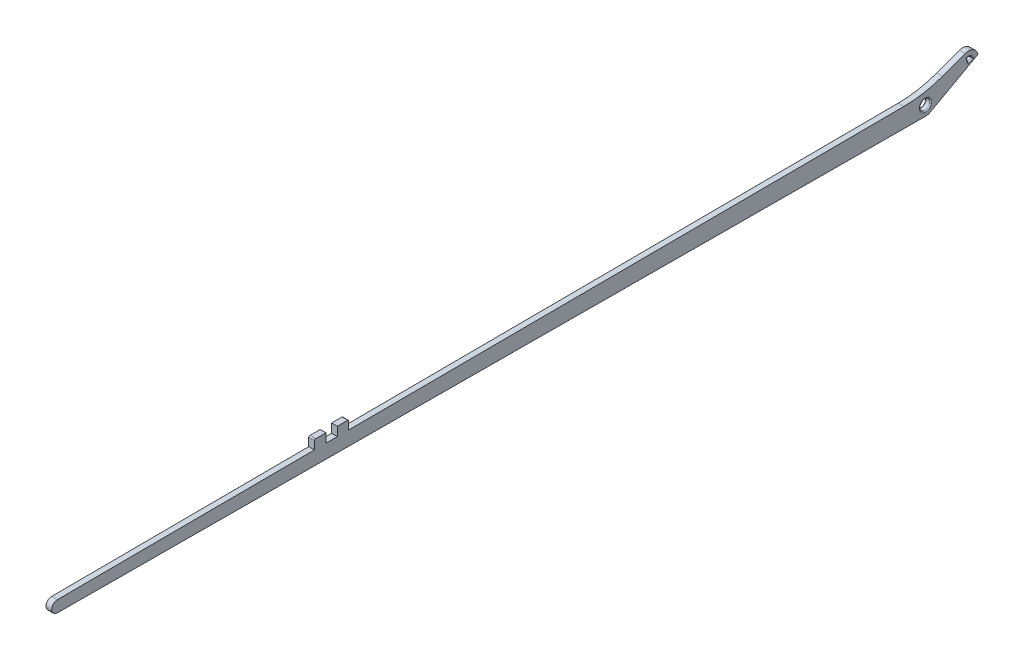
ISO-10303-21;
HEADER;
FILE_DESCRIPTION(('STEP AP214'),'2;1');
FILE_NAME('part.step','',(''),(''),'','','');
FILE_SCHEMA(('AUTOMOTIVE_DESIGN { 1 0 10303 214 1 1 1 1 }'));
ENDSEC;
DATA;
#1=APPLICATION_CONTEXT('core data for automotive mechanical design processes');
#2=APPLICATION_PROTOCOL_DEFINITION('international standard','automotive_design',2000,#1);
#3=PRODUCT_CONTEXT('',#1,'mechanical');
#4=PRODUCT('Part','Part','',(#3));
#5=PRODUCT_RELATED_PRODUCT_CATEGORY('part','',(#4));
#6=PRODUCT_DEFINITION_FORMATION('','',#4);
#7=PRODUCT_DEFINITION_CONTEXT('part definition',#1,'design');
#8=PRODUCT_DEFINITION('design','',#6,#7);
#9=PRODUCT_DEFINITION_SHAPE('','',#8);
#10=(LENGTH_UNIT() NAMED_UNIT(*) SI_UNIT(.MILLI.,.METRE.));
#11=(NAMED_UNIT(*) PLANE_ANGLE_UNIT() SI_UNIT($,.RADIAN.));
#12=(NAMED_UNIT(*) SI_UNIT($,.STERADIAN.) SOLID_ANGLE_UNIT());
#13=UNCERTAINTY_MEASURE_WITH_UNIT(LENGTH_MEASURE(1.E-05),#10,'distance_accuracy_value','');
#14=(GEOMETRIC_REPRESENTATION_CONTEXT(3) GLOBAL_UNCERTAINTY_ASSIGNED_CONTEXT((#13)) GLOBAL_UNIT_ASSIGNED_CONTEXT((#10,
#11,#12)) REPRESENTATION_CONTEXT('',''));
#15=CARTESIAN_POINT('',(0.,0.,0.));
#16=DIRECTION('',(0.,0.,1.));
#17=DIRECTION('',(1.,0.,0.));
#18=AXIS2_PLACEMENT_3D('',#15,#16,#17);
#19=CARTESIAN_POINT('',(2.5,0.,0.));
#20=DIRECTION('',(-1.,0.,0.));
#21=DIRECTION('',(0.,0.,1.));
#22=AXIS2_PLACEMENT_3D('',#19,#20,#21);
#23=CYLINDRICAL_SURFACE('',#22,4.25);
#24=CARTESIAN_POINT('',(0.,0.,0.));
#25=DIRECTION('',(1.,0.,0.));
#26=DIRECTION('',(0.,0.,-1.));
#27=AXIS2_PLACEMENT_3D('',#24,#25,#26);
#28=CIRCLE('',#27,4.25);
#29=CARTESIAN_POINT('',(0.,-4.24995493044189,0.0195726649313021));
#30=VERTEX_POINT('',#29);
#31=CARTESIAN_POINT('',(0.,-3.72479222349383,-2.04656367890176));
#32=VERTEX_POINT('',#31);
#33=EDGE_CURVE('E238',#30,#32,#28,.T.);
#34=ORIENTED_EDGE('',*,*,#33,.T.);
#35=DIRECTION('',(-1.,0.,0.));
#36=VECTOR('',#35,1.);
#37=CARTESIAN_POINT('',(2.5,-3.72479222349383,-2.04656367890176));
#38=LINE('',#37,#36);
#39=CARTESIAN_POINT('',(2.5,-3.72479222349383,-2.04656367890176));
#40=VERTEX_POINT('',#39);
#41=EDGE_CURVE('E218',#40,#32,#38,.T.);
#42=ORIENTED_EDGE('',*,*,#41,.F.);
#43=CARTESIAN_POINT('',(2.5,0.,0.));
#44=DIRECTION('',(1.,0.,0.));
#45=DIRECTION('',(0.,0.,-1.));
#46=AXIS2_PLACEMENT_3D('',#43,#44,#45);
#47=CIRCLE('',#46,4.25);
#48=CARTESIAN_POINT('',(2.5,-4.24995493044189,0.0195726649313021));
#49=VERTEX_POINT('',#48);
#50=EDGE_CURVE('E225',#49,#40,#47,.T.);
#51=ORIENTED_EDGE('',*,*,#50,.F.);
#52=DIRECTION('',(-1.,0.,0.));
#53=VECTOR('',#52,1.);
#54=CARTESIAN_POINT('',(2.5,-4.24995493044189,0.0195726649313021));
#55=LINE('',#54,#53);
#56=EDGE_CURVE('E254',#49,#30,#55,.T.);
#57=ORIENTED_EDGE('',*,*,#56,.T.);
#58=EDGE_LOOP('',(#34,#42,#51,#57));
#59=FACE_BOUND('',#58,.T.);
#60=ADVANCED_FACE('F43',(#59),#23,.T.);
#61=CARTESIAN_POINT('',(2.5,-3.72479222349383,-2.04656367890176));
#62=DIRECTION('',(0.,0.876421699645607,0.481544395035707));
#63=DIRECTION('',(0.,-0.481544395035707,0.876421699645607));
#64=AXIS2_PLACEMENT_3D('',#61,#62,#63);
#65=PLANE('',#64);
#66=DIRECTION('',(0.,0.481544395035707,-0.876421699645607));
#67=VECTOR('',#66,1.);
#68=CARTESIAN_POINT('',(0.,-3.72479222349383,-2.04656367890176));
#69=LINE('',#68,#67);
#70=CARTESIAN_POINT('',(0.,7.75707294263171,-22.9438181952818));
#71=VERTEX_POINT('',#70);
#72=EDGE_CURVE('E355',#32,#71,#69,.T.);
#73=ORIENTED_EDGE('',*,*,#72,.T.);
#74=DIRECTION('',(-1.,0.,0.));
#75=VECTOR('',#74,1.);
#76=CARTESIAN_POINT('',(2.5,7.75707294263171,-22.9438181952818));
#77=LINE('',#76,#75);
#78=CARTESIAN_POINT('',(2.5,7.75707294263171,-22.9438181952818));
#79=VERTEX_POINT('',#78);
#80=EDGE_CURVE('E221',#79,#71,#77,.T.);
#81=ORIENTED_EDGE('',*,*,#80,.F.);
#82=DIRECTION('',(0.,0.481544395035707,-0.876421699645607));
#83=VECTOR('',#82,1.);
#84=CARTESIAN_POINT('',(2.5,-3.72479222349383,-2.04656367890176));
#85=LINE('',#84,#83);
#86=EDGE_CURVE('E214',#40,#79,#85,.T.);
#87=ORIENTED_EDGE('',*,*,#86,.F.);
#88=ORIENTED_EDGE('',*,*,#41,.T.);
#89=EDGE_LOOP('',(#73,#81,#87,#88));
#90=FACE_BOUND('',#89,.T.);
#91=ADVANCED_FACE('F216',(#90),#65,.F.);
#92=CARTESIAN_POINT('',(2.5,6.84040286651326,-18.7938524157182));
#93=DIRECTION('',(-1.,0.,0.));
#94=DIRECTION('',(0.,0.,1.));
#95=AXIS2_PLACEMENT_3D('',#92,#93,#94);
#96=CYLINDRICAL_SURFACE('',#95,4.25);
#97=CARTESIAN_POINT('',(0.,6.84040286651326,-18.7938524157182));
#98=DIRECTION('',(1.,0.,0.));
#99=DIRECTION('',(0.,0.,-1.));
#100=AXIS2_PLACEMENT_3D('',#97,#98,#99);
#101=CIRCLE('',#100,4.25);
#102=CARTESIAN_POINT('',(0.,10.8340965048534,-17.3402668065841));
#103=VERTEX_POINT('',#102);
#104=EDGE_CURVE('E488',#71,#103,#101,.T.);
#105=ORIENTED_EDGE('',*,*,#104,.T.);
#106=DIRECTION('',(-1.,0.,0.));
#107=VECTOR('',#106,1.);
#108=CARTESIAN_POINT('',(2.5,10.8340965048534,-17.3402668065841));
#109=LINE('',#108,#107);
#110=CARTESIAN_POINT('',(2.5,10.8340965048534,-17.3402668065841));
#111=VERTEX_POINT('',#110);
#112=EDGE_CURVE('E244',#111,#103,#109,.T.);
#113=ORIENTED_EDGE('',*,*,#112,.F.);
#114=CARTESIAN_POINT('',(2.5,6.84040286651326,-18.7938524157182));
#115=DIRECTION('',(1.,0.,0.));
#116=DIRECTION('',(0.,0.,-1.));
#117=AXIS2_PLACEMENT_3D('',#114,#115,#116);
#118=CIRCLE('',#117,4.25);
#119=EDGE_CURVE('E224',#79,#111,#118,.T.);
#120=ORIENTED_EDGE('',*,*,#119,.F.);
#121=ORIENTED_EDGE('',*,*,#80,.T.);
#122=EDGE_LOOP('',(#105,#113,#120,#121));
#123=FACE_BOUND('',#122,.T.);
#124=ADVANCED_FACE('F403',(#123),#96,.T.);
#125=CARTESIAN_POINT('',(2.5,3.99369363834012,1.45358560913407));
#126=DIRECTION('',(0.,0.93969262078591,0.342020143325663));
#127=DIRECTION('',(0.,-0.342020143325663,0.93969262078591));
#128=AXIS2_PLACEMENT_3D('',#125,#126,#127);
#129=PLANE('',#128);
#130=DIRECTION('',(0.,0.342020143325663,-0.939692620785911));
#131=VECTOR('',#130,1.);
#132=CARTESIAN_POINT('',(0.,3.99369363834012,1.45358560913407));
#133=LINE('',#132,#131);
#134=CARTESIAN_POINT('',(0.,7.22133319531005,-7.4142811917795));
#135=VERTEX_POINT('',#134);
#136=EDGE_CURVE('E482',#135,#103,#133,.T.);
#137=ORIENTED_EDGE('',*,*,#136,.F.);
#138=DIRECTION('',(-1.,0.,0.));
#139=VECTOR('',#138,1.);
#140=CARTESIAN_POINT('',(2.5,7.22133319531005,-7.4142811917795));
#141=LINE('',#140,#139);
#142=CARTESIAN_POINT('',(2.5,7.22133319531005,-7.4142811917795));
#143=VERTEX_POINT('',#142);
#144=EDGE_CURVE('E474',#143,#135,#141,.T.);
#145=ORIENTED_EDGE('',*,*,#144,.F.);
#146=DIRECTION('',(0.,0.342020143325663,-0.939692620785911));
#147=VECTOR('',#146,1.);
#148=CARTESIAN_POINT('',(2.5,3.99369363834012,1.45358560913407));
#149=LINE('',#148,#147);
#150=EDGE_CURVE('E485',#143,#111,#149,.T.);
#151=ORIENTED_EDGE('',*,*,#150,.T.);
#152=ORIENTED_EDGE('',*,*,#112,.T.);
#153=EDGE_LOOP('',(#137,#145,#151,#152));
#154=FACE_BOUND('',#153,.T.);
#155=ADVANCED_FACE('F480',(#154),#129,.T.);
#156=CARTESIAN_POINT('',(2.5,54.2059642346056,9.68672597450365));
#157=DIRECTION('',(-1.,0.,0.));
#158=DIRECTION('',(0.,0.,1.));
#159=AXIS2_PLACEMENT_3D('',#156,#157,#158);
#160=CYLINDRICAL_SURFACE('',#159,50.);
#161=CARTESIAN_POINT('',(0.,54.2059642346056,9.68672597450365));
#162=DIRECTION('',(1.,0.,0.));
#163=DIRECTION('',(0.,0.,-1.));
#164=AXIS2_PLACEMENT_3D('',#161,#162,#163);
#165=CIRCLE('',#164,50.);
#166=CARTESIAN_POINT('',(0.,4.20649446470076,9.45645932825302));
#167=VERTEX_POINT('',#166);
#168=EDGE_CURVE('E492',#167,#135,#165,.T.);
#169=ORIENTED_EDGE('',*,*,#168,.F.);
#170=DIRECTION('',(-1.,0.,0.));
#171=VECTOR('',#170,1.);
#172=CARTESIAN_POINT('',(2.5,4.20649446470076,9.45645932825302));
#173=LINE('',#172,#171);
#174=CARTESIAN_POINT('',(2.5,4.20649446470076,9.45645932825302));
#175=VERTEX_POINT('',#174);
#176=EDGE_CURVE('E472',#175,#167,#173,.T.);
#177=ORIENTED_EDGE('',*,*,#176,.F.);
#178=CARTESIAN_POINT('',(2.5,54.2059642346056,9.68672597450365));
#179=DIRECTION('',(1.,0.,0.));
#180=DIRECTION('',(0.,0.,-1.));
#181=AXIS2_PLACEMENT_3D('',#178,#179,#180);
#182=CIRCLE('',#181,50.);
#183=EDGE_CURVE('E548',#175,#143,#182,.T.);
#184=ORIENTED_EDGE('',*,*,#183,.T.);
#185=ORIENTED_EDGE('',*,*,#144,.T.);
#186=EDGE_LOOP('',(#169,#177,#184,#185));
#187=FACE_BOUND('',#186,.T.);
#188=ADVANCED_FACE('F597',(#187),#160,.F.);
#189=CARTESIAN_POINT('',(2.5,4.24995493044191,0.0195726649313038));
#190=DIRECTION('',(0.,0.999989395398096,0.00460533292501265));
#191=DIRECTION('',(0.,-0.00460533292501265,0.999989395398096));
#192=AXIS2_PLACEMENT_3D('',#189,#190,#191);
#193=PLANE('',#192);
#194=DIRECTION('',(0.,0.00460533292501265,-0.999989395398096));
#195=VECTOR('',#194,1.);
#196=CARTESIAN_POINT('',(0.,4.24995493044191,0.0195726649313038));
#197=LINE('',#196,#195);
#198=CARTESIAN_POINT('',(0.,3.08718617481469,252.5));
#199=VERTEX_POINT('',#198);
#200=EDGE_CURVE('E445',#199,#167,#197,.T.);
#201=ORIENTED_EDGE('',*,*,#200,.F.);
#202=DIRECTION('',(-1.,0.,0.));
#203=VECTOR('',#202,1.);
#204=CARTESIAN_POINT('',(2.5,3.08718617481469,252.5));
#205=LINE('',#204,#203);
#206=CARTESIAN_POINT('',(2.5,3.08718617481469,252.5));
#207=VERTEX_POINT('',#206);
#208=EDGE_CURVE('E469',#207,#199,#205,.T.);
#209=ORIENTED_EDGE('',*,*,#208,.F.);
#210=DIRECTION('',(0.,0.00460533292501265,-0.999989395398096));
#211=VECTOR('',#210,1.);
#212=CARTESIAN_POINT('',(2.5,4.24995493044191,0.0195726649313038));
#213=LINE('',#212,#211);
#214=EDGE_CURVE('E543',#207,#175,#213,.T.);
#215=ORIENTED_EDGE('',*,*,#214,.T.);
#216=ORIENTED_EDGE('',*,*,#176,.T.);
#217=EDGE_LOOP('',(#201,#209,#215,#216));
#218=FACE_BOUND('',#217,.T.);
#219=ADVANCED_FACE('F596',(#218),#193,.T.);
#220=CARTESIAN_POINT('',(2.5,0.,252.5));
#221=DIRECTION('',(0.,0.,-1.));
#222=DIRECTION('',(-1.,0.,0.));
#223=AXIS2_PLACEMENT_3D('',#220,#221,#222);
#224=PLANE('',#223);
#225=DIRECTION('',(0.,-1.,0.));
#226=VECTOR('',#225,1.);
#227=CARTESIAN_POINT('',(0.,0.,252.5));
#228=LINE('',#227,#226);
#229=CARTESIAN_POINT('',(0.,6.49999999999997,252.5));
#230=VERTEX_POINT('',#229);
#231=EDGE_CURVE('E497',#230,#199,#228,.T.);
#232=ORIENTED_EDGE('',*,*,#231,.F.);
#233=DIRECTION('',(-1.,0.,0.));
#234=VECTOR('',#233,1.);
#235=CARTESIAN_POINT('',(2.5,6.49999999999997,252.5));
#236=LINE('',#235,#234);
#237=CARTESIAN_POINT('',(2.5,6.49999999999997,252.5));
#238=VERTEX_POINT('',#237);
#239=EDGE_CURVE('E288',#230,#238,#236,.F.);
#240=ORIENTED_EDGE('',*,*,#239,.T.);
#241=DIRECTION('',(0.,-1.,0.));
#242=VECTOR('',#241,1.);
#243=CARTESIAN_POINT('',(2.5,0.,252.5));
#244=LINE('',#243,#242);
#245=EDGE_CURVE('E547',#238,#207,#244,.T.);
#246=ORIENTED_EDGE('',*,*,#245,.T.);
#247=ORIENTED_EDGE('',*,*,#208,.T.);
#248=EDGE_LOOP('',(#232,#240,#246,#247));
#249=FACE_BOUND('',#248,.T.);
#250=ADVANCED_FACE('F593',(#249),#224,.T.);
#251=CARTESIAN_POINT('',(2.5,7.00000000000015,0.));
#252=DIRECTION('',(0.,1.,0.));
#253=DIRECTION('',(0.,0.,1.));
#254=AXIS2_PLACEMENT_3D('',#251,#252,#253);
#255=PLANE('',#254);
#256=DIRECTION('',(0.,0.,-1.));
#257=VECTOR('',#256,1.);
#258=CARTESIAN_POINT('',(2.5,7.00000000000015,0.));
#259=LINE('',#258,#257);
#260=CARTESIAN_POINT('',(2.5,6.99999999999997,257.5));
#261=VERTEX_POINT('',#260);
#262=CARTESIAN_POINT('',(2.5,6.99999999999997,253.));
#263=VERTEX_POINT('',#262);
#264=EDGE_CURVE('E552',#261,#263,#259,.T.);
#265=ORIENTED_EDGE('',*,*,#264,.T.);
#266=DIRECTION('',(-1.,0.,0.));
#267=VECTOR('',#266,1.);
#268=CARTESIAN_POINT('',(2.5,6.99999999999997,253.));
#269=LINE('',#268,#267);
#270=CARTESIAN_POINT('',(0.,6.99999999999997,253.));
#271=VERTEX_POINT('',#270);
#272=EDGE_CURVE('E285',#263,#271,#269,.T.);
#273=ORIENTED_EDGE('',*,*,#272,.T.);
#274=DIRECTION('',(0.,0.,-1.));
#275=VECTOR('',#274,1.);
#276=CARTESIAN_POINT('',(0.,7.00000000000015,0.));
#277=LINE('',#276,#275);
#278=CARTESIAN_POINT('',(0.,6.99999999999997,257.5));
#279=VERTEX_POINT('',#278);
#280=EDGE_CURVE('E499',#279,#271,#277,.T.);
#281=ORIENTED_EDGE('',*,*,#280,.F.);
#282=DIRECTION('',(-1.,0.,0.));
#283=VECTOR('',#282,1.);
#284=CARTESIAN_POINT('',(2.5,6.99999999999997,257.5));
#285=LINE('',#284,#283);
#286=EDGE_CURVE('E467',#261,#279,#285,.T.);
#287=ORIENTED_EDGE('',*,*,#286,.F.);
#288=EDGE_LOOP('',(#265,#273,#281,#287));
#289=FACE_BOUND('',#288,.T.);
#290=ADVANCED_FACE('F567',(#289),#255,.T.);
#291=CARTESIAN_POINT('',(2.5,0.,257.5));
#292=DIRECTION('',(0.,0.,1.));
#293=DIRECTION('',(1.,0.,0.));
#294=AXIS2_PLACEMENT_3D('',#291,#292,#293);
#295=PLANE('',#294);
#296=DIRECTION('',(0.,1.,0.));
#297=VECTOR('',#296,1.);
#298=CARTESIAN_POINT('',(0.,0.,257.5));
#299=LINE('',#298,#297);
#300=CARTESIAN_POINT('',(0.,3.06415926599843,257.5));
#301=VERTEX_POINT('',#300);
#302=EDGE_CURVE('E502',#301,#279,#299,.T.);
#303=ORIENTED_EDGE('',*,*,#302,.F.);
#304=DIRECTION('',(-1.,0.,0.));
#305=VECTOR('',#304,1.);
#306=CARTESIAN_POINT('',(2.5,3.06415926599843,257.5));
#307=LINE('',#306,#305);
#308=CARTESIAN_POINT('',(2.5,3.06415926599843,257.5));
#309=VERTEX_POINT('',#308);
#310=EDGE_CURVE('E465',#309,#301,#307,.T.);
#311=ORIENTED_EDGE('',*,*,#310,.F.);
#312=DIRECTION('',(0.,1.,0.));
#313=VECTOR('',#312,1.);
#314=CARTESIAN_POINT('',(2.5,0.,257.5));
#315=LINE('',#314,#313);
#316=EDGE_CURVE('E574',#309,#261,#315,.T.);
#317=ORIENTED_EDGE('',*,*,#316,.T.);
#318=ORIENTED_EDGE('',*,*,#286,.T.);
#319=EDGE_LOOP('',(#303,#311,#317,#318));
#320=FACE_BOUND('',#319,.T.);
#321=ADVANCED_FACE('F571',(#320),#295,.T.);
#322=CARTESIAN_POINT('',(2.5,4.24995493044191,0.0195726649313038));
#323=DIRECTION('',(0.,0.999989395398096,0.00460533292501265));
#324=DIRECTION('',(0.,-0.00460533292501265,0.999989395398096));
#325=AXIS2_PLACEMENT_3D('',#322,#323,#324);
#326=PLANE('',#325);
#327=DIRECTION('',(0.,0.00460533292501265,-0.999989395398096));
#328=VECTOR('',#327,1.);
#329=CARTESIAN_POINT('',(0.,4.24995493044191,0.0195726649313038));
#330=LINE('',#329,#328);
#331=CARTESIAN_POINT('',(0.,3.04113235718216,262.5));
#332=VERTEX_POINT('',#331);
#333=EDGE_CURVE('E505',#332,#301,#330,.T.);
#334=ORIENTED_EDGE('',*,*,#333,.F.);
#335=DIRECTION('',(-1.,0.,0.));
#336=VECTOR('',#335,1.);
#337=CARTESIAN_POINT('',(2.5,3.04113235718216,262.5));
#338=LINE('',#337,#336);
#339=CARTESIAN_POINT('',(2.5,3.04113235718216,262.5));
#340=VERTEX_POINT('',#339);
#341=EDGE_CURVE('E463',#340,#332,#338,.T.);
#342=ORIENTED_EDGE('',*,*,#341,.F.);
#343=DIRECTION('',(0.,0.00460533292501265,-0.999989395398096));
#344=VECTOR('',#343,1.);
#345=CARTESIAN_POINT('',(2.5,4.24995493044191,0.0195726649313038));
#346=LINE('',#345,#344);
#347=EDGE_CURVE('E524',#340,#309,#346,.T.);
#348=ORIENTED_EDGE('',*,*,#347,.T.);
#349=ORIENTED_EDGE('',*,*,#310,.T.);
#350=EDGE_LOOP('',(#334,#342,#348,#349));
#351=FACE_BOUND('',#350,.T.);
#352=ADVANCED_FACE('F580',(#351),#326,.T.);
#353=CARTESIAN_POINT('',(2.5,0.,262.5));
#354=DIRECTION('',(0.,0.,1.));
#355=DIRECTION('',(1.,0.,0.));
#356=AXIS2_PLACEMENT_3D('',#353,#354,#355);
#357=PLANE('',#356);
#358=DIRECTION('',(0.,1.,0.));
#359=VECTOR('',#358,1.);
#360=CARTESIAN_POINT('',(0.,0.,262.5));
#361=LINE('',#360,#359);
#362=CARTESIAN_POINT('',(0.,6.99999999999997,262.5));
#363=VERTEX_POINT('',#362);
#364=EDGE_CURVE('E446',#332,#363,#361,.T.);
#365=ORIENTED_EDGE('',*,*,#364,.T.);
#366=DIRECTION('',(-1.,0.,0.));
#367=VECTOR('',#366,1.);
#368=CARTESIAN_POINT('',(2.5,6.99999999999997,262.5));
#369=LINE('',#368,#367);
#370=CARTESIAN_POINT('',(2.5,6.99999999999997,262.5));
#371=VERTEX_POINT('',#370);
#372=EDGE_CURVE('E460',#371,#363,#369,.T.);
#373=ORIENTED_EDGE('',*,*,#372,.F.);
#374=DIRECTION('',(0.,1.,0.));
#375=VECTOR('',#374,1.);
#376=CARTESIAN_POINT('',(2.5,0.,262.5));
#377=LINE('',#376,#375);
#378=EDGE_CURVE('E520',#340,#371,#377,.T.);
#379=ORIENTED_EDGE('',*,*,#378,.F.);
#380=ORIENTED_EDGE('',*,*,#341,.T.);
#381=EDGE_LOOP('',(#365,#373,#379,#380));
#382=FACE_BOUND('',#381,.T.);
#383=ADVANCED_FACE('F510',(#382),#357,.F.);
#384=CARTESIAN_POINT('',(2.5,7.00000000000001,0.));
#385=DIRECTION('',(0.,-1.,0.));
#386=DIRECTION('',(0.,0.,-1.));
#387=AXIS2_PLACEMENT_3D('',#384,#385,#386);
#388=PLANE('',#387);
#389=DIRECTION('',(0.,0.,1.));
#390=VECTOR('',#389,1.);
#391=CARTESIAN_POINT('',(0.,7.00000000000001,0.));
#392=LINE('',#391,#390);
#393=CARTESIAN_POINT('',(0.,6.99999999999997,267.));
#394=VERTEX_POINT('',#393);
#395=EDGE_CURVE('E441',#363,#394,#392,.T.);
#396=ORIENTED_EDGE('',*,*,#395,.T.);
#397=DIRECTION('',(-1.,0.,0.));
#398=VECTOR('',#397,1.);
#399=CARTESIAN_POINT('',(2.5,6.99999999999997,267.));
#400=LINE('',#399,#398);
#401=CARTESIAN_POINT('',(2.5,6.99999999999997,267.));
#402=VERTEX_POINT('',#401);
#403=EDGE_CURVE('E269',#394,#402,#400,.F.);
#404=ORIENTED_EDGE('',*,*,#403,.T.);
#405=DIRECTION('',(0.,0.,1.));
#406=VECTOR('',#405,1.);
#407=CARTESIAN_POINT('',(2.5,7.00000000000001,0.));
#408=LINE('',#407,#406);
#409=EDGE_CURVE('E517',#371,#402,#408,.T.);
#410=ORIENTED_EDGE('',*,*,#409,.F.);
#411=ORIENTED_EDGE('',*,*,#372,.T.);
#412=EDGE_LOOP('',(#396,#404,#410,#411));
#413=FACE_BOUND('',#412,.T.);
#414=ADVANCED_FACE('F515',(#413),#388,.F.);
#415=CARTESIAN_POINT('',(2.5,0.,267.5));
#416=DIRECTION('',(0.,0.,-1.));
#417=DIRECTION('',(-1.,0.,0.));
#418=AXIS2_PLACEMENT_3D('',#415,#416,#417);
#419=PLANE('',#418);
#420=DIRECTION('',(0.,-1.,0.));
#421=VECTOR('',#420,1.);
#422=CARTESIAN_POINT('',(2.5,0.,267.5));
#423=LINE('',#422,#421);
#424=CARTESIAN_POINT('',(2.5,6.49999999999997,267.5));
#425=VERTEX_POINT('',#424);
#426=CARTESIAN_POINT('',(2.5,3.0181054483659,267.5));
#427=VERTEX_POINT('',#426);
#428=EDGE_CURVE('E519',#425,#427,#423,.T.);
#429=ORIENTED_EDGE('',*,*,#428,.F.);
#430=DIRECTION('',(-1.,0.,0.));
#431=VECTOR('',#430,1.);
#432=CARTESIAN_POINT('',(2.5,6.49999999999997,267.5));
#433=LINE('',#432,#431);
#434=CARTESIAN_POINT('',(0.,6.49999999999997,267.5));
#435=VERTEX_POINT('',#434);
#436=EDGE_CURVE('E239',#425,#435,#433,.T.);
#437=ORIENTED_EDGE('',*,*,#436,.T.);
#438=DIRECTION('',(0.,-1.,0.));
#439=VECTOR('',#438,1.);
#440=CARTESIAN_POINT('',(0.,0.,267.5));
#441=LINE('',#440,#439);
#442=CARTESIAN_POINT('',(0.,3.0181054483659,267.5));
#443=VERTEX_POINT('',#442);
#444=EDGE_CURVE('E432',#435,#443,#441,.T.);
#445=ORIENTED_EDGE('',*,*,#444,.T.);
#446=DIRECTION('',(-1.,0.,0.));
#447=VECTOR('',#446,1.);
#448=CARTESIAN_POINT('',(2.5,3.0181054483659,267.5));
#449=LINE('',#448,#447);
#450=EDGE_CURVE('E458',#427,#443,#449,.T.);
#451=ORIENTED_EDGE('',*,*,#450,.F.);
#452=EDGE_LOOP('',(#429,#437,#445,#451));
#453=FACE_BOUND('',#452,.T.);
#454=ADVANCED_FACE('F540',(#453),#419,.F.);
#455=CARTESIAN_POINT('',(0.,2.49999999999995,380.));
#456=VERTEX_POINT('',#455);
#457=EDGE_CURVE('E437',#456,#443,#197,.T.);
#458=ORIENTED_EDGE('',*,*,#457,.F.);
#459=DIRECTION('',(-1.,0.,0.));
#460=VECTOR('',#459,1.);
#461=CARTESIAN_POINT('',(2.5,2.49999999999995,380.));
#462=LINE('',#461,#460);
#463=CARTESIAN_POINT('',(2.5,2.49999999999995,380.));
#464=VERTEX_POINT('',#463);
#465=EDGE_CURVE('E456',#464,#456,#462,.T.);
#466=ORIENTED_EDGE('',*,*,#465,.F.);
#467=EDGE_CURVE('E522',#464,#427,#213,.T.);
#468=ORIENTED_EDGE('',*,*,#467,.T.);
#469=ORIENTED_EDGE('',*,*,#450,.T.);
#470=EDGE_LOOP('',(#458,#466,#468,#469));
#471=FACE_BOUND('',#470,.T.);
#472=ADVANCED_FACE('F538',(#471),#193,.T.);
#473=CARTESIAN_POINT('',(2.5,0.,380.));
#474=DIRECTION('',(-1.,0.,0.));
#475=DIRECTION('',(0.,0.,1.));
#476=AXIS2_PLACEMENT_3D('',#473,#474,#475);
#477=CYLINDRICAL_SURFACE('',#476,2.50000000000002);
#478=CARTESIAN_POINT('',(0.,0.,380.));
#479=DIRECTION('',(1.,0.,0.));
#480=DIRECTION('',(0.,0.,-1.));
#481=AXIS2_PLACEMENT_3D('',#478,#479,#480);
#482=CIRCLE('',#481,2.50000000000002);
#483=CARTESIAN_POINT('',(0.,-2.50000000000005,380.));
#484=VERTEX_POINT('',#483);
#485=EDGE_CURVE('E443',#456,#484,#482,.T.);
#486=ORIENTED_EDGE('',*,*,#485,.T.);
#487=DIRECTION('',(-1.,0.,0.));
#488=VECTOR('',#487,1.);
#489=CARTESIAN_POINT('',(2.5,-2.50000000000005,380.));
#490=LINE('',#489,#488);
#491=CARTESIAN_POINT('',(2.5,-2.50000000000005,380.));
#492=VERTEX_POINT('',#491);
#493=EDGE_CURVE('E453',#492,#484,#490,.T.);
#494=ORIENTED_EDGE('',*,*,#493,.F.);
#495=CARTESIAN_POINT('',(2.5,0.,380.));
#496=DIRECTION('',(1.,0.,0.));
#497=DIRECTION('',(0.,0.,-1.));
#498=AXIS2_PLACEMENT_3D('',#495,#496,#497);
#499=CIRCLE('',#498,2.50000000000002);
#500=EDGE_CURVE('E528',#464,#492,#499,.T.);
#501=ORIENTED_EDGE('',*,*,#500,.F.);
#502=ORIENTED_EDGE('',*,*,#465,.T.);
#503=EDGE_LOOP('',(#486,#494,#501,#502));
#504=FACE_BOUND('',#503,.T.);
#505=ADVANCED_FACE('F411',(#504),#477,.T.);
#506=CARTESIAN_POINT('',(2.5,6.84040286651326,-18.7938524157182));
#507=DIRECTION('',(-1.,0.,0.));
#508=DIRECTION('',(0.,0.,1.));
#509=AXIS2_PLACEMENT_3D('',#506,#507,#508);
#510=CYLINDRICAL_SURFACE('',#509,1.85);
#511=DIRECTION('',(-1.,0.,0.));
#512=VECTOR('',#511,1.);
#513=CARTESIAN_POINT('',(2.5,8.57883421496719,-18.1611151505657));
#514=LINE('',#513,#512);
#515=CARTESIAN_POINT('',(2.,8.57883421496719,-18.1611151505657));
#516=VERTEX_POINT('',#515);
#517=CARTESIAN_POINT('',(0.5,8.57883421496719,-18.1611151505657));
#518=VERTEX_POINT('',#517);
#519=EDGE_CURVE('E248',#516,#518,#514,.T.);
#520=ORIENTED_EDGE('',*,*,#519,.T.);
#521=CARTESIAN_POINT('',(0.5,6.84040286651326,-18.7938524157182));
#522=DIRECTION('',(1.,0.,0.));
#523=DIRECTION('',(0.,0.,-1.));
#524=AXIS2_PLACEMENT_3D('',#521,#522,#523);
#525=CIRCLE('',#524,1.85);
#526=CARTESIAN_POINT('',(0.5,7.47314013166574,-20.5322837641721));
#527=VERTEX_POINT('',#526);
#528=EDGE_CURVE('E298',#518,#527,#525,.F.);
#529=ORIENTED_EDGE('',*,*,#528,.T.);
#530=DIRECTION('',(-1.,0.,0.));
#531=VECTOR('',#530,1.);
#532=CARTESIAN_POINT('',(2.5,7.47314013166574,-20.5322837641721));
#533=LINE('',#532,#531);
#534=CARTESIAN_POINT('',(2.,7.47314013166574,-20.5322837641721));
#535=VERTEX_POINT('',#534);
#536=EDGE_CURVE('E253',#535,#527,#533,.T.);
#537=ORIENTED_EDGE('',*,*,#536,.F.);
#538=CARTESIAN_POINT('',(2.,6.84040286651326,-18.7938524157182));
#539=DIRECTION('',(1.,0.,0.));
#540=DIRECTION('',(0.,0.,-1.));
#541=AXIS2_PLACEMENT_3D('',#538,#539,#540);
#542=CIRCLE('',#541,1.85);
#543=EDGE_CURVE('E296',#535,#516,#542,.T.);
#544=ORIENTED_EDGE('',*,*,#543,.T.);
#545=EDGE_LOOP('',(#520,#529,#537,#544));
#546=FACE_BOUND('',#545,.T.);
#547=ADVANCED_FACE('F364',(#546),#510,.F.);
#548=CARTESIAN_POINT('',(2.5,0.,0.));
#549=DIRECTION('',(0.,-0.93969262078591,-0.342020143325665));
#550=DIRECTION('',(0.,0.342020143325665,-0.93969262078591));
#551=AXIS2_PLACEMENT_3D('',#548,#549,#550);
#552=PLANE('',#551);
#553=ORIENTED_EDGE('',*,*,#536,.T.);
#554=DIRECTION('',(0.,-0.342020143325665,0.93969262078591));
#555=VECTOR('',#554,1.);
#556=CARTESIAN_POINT('',(0.5,0.,0.));
#557=LINE('',#556,#555);
#558=CARTESIAN_POINT('',(0.5,6.84040286651326,-18.7938524157182));
#559=VERTEX_POINT('',#558);
#560=EDGE_CURVE('E65',#527,#559,#557,.T.);
#561=ORIENTED_EDGE('',*,*,#560,.T.);
#562=DIRECTION('',(-1.,0.,0.));
#563=VECTOR('',#562,1.);
#564=CARTESIAN_POINT('',(2.5,6.84040286651326,-18.7938524157182));
#565=LINE('',#564,#563);
#566=CARTESIAN_POINT('',(2.,6.84040286651326,-18.7938524157182));
#567=VERTEX_POINT('',#566);
#568=EDGE_CURVE('E251',#567,#559,#565,.T.);
#569=ORIENTED_EDGE('',*,*,#568,.F.);
#570=DIRECTION('',(0.,-0.342020143325665,0.93969262078591));
#571=VECTOR('',#570,1.);
#572=CARTESIAN_POINT('',(2.,7.47314013166574,-20.5322837641722));
#573=LINE('',#572,#571);
#574=EDGE_CURVE('E301',#567,#535,#573,.F.);
#575=ORIENTED_EDGE('',*,*,#574,.T.);
#576=EDGE_LOOP('',(#553,#561,#569,#575));
#577=FACE_BOUND('',#576,.T.);
#578=ADVANCED_FACE('F367',(#577),#552,.F.);
#579=CARTESIAN_POINT('',(2.5,-4.24995493044186,0.019572664931302));
#580=DIRECTION('',(0.,0.999989395398096,-0.00460533292501228));
#581=DIRECTION('',(0.,0.00460533292501228,0.999989395398096));
#582=AXIS2_PLACEMENT_3D('',#579,#580,#581);
#583=PLANE('',#582);
#584=DIRECTION('',(0.,-0.00460533292501228,-0.999989395398096));
#585=VECTOR('',#584,1.);
#586=CARTESIAN_POINT('',(0.,-4.24995493044186,0.019572664931302));
#587=LINE('',#586,#585);
#588=EDGE_CURVE('E235',#484,#30,#587,.T.);
#589=ORIENTED_EDGE('',*,*,#588,.T.);
#590=ORIENTED_EDGE('',*,*,#56,.F.);
#591=DIRECTION('',(0.,-0.00460533292501228,-0.999989395398096));
#592=VECTOR('',#591,1.);
#593=CARTESIAN_POINT('',(2.5,-4.24995493044186,0.019572664931302));
#594=LINE('',#593,#592);
#595=EDGE_CURVE('E231',#492,#49,#594,.T.);
#596=ORIENTED_EDGE('',*,*,#595,.F.);
#597=ORIENTED_EDGE('',*,*,#493,.T.);
#598=EDGE_LOOP('',(#589,#590,#596,#597));
#599=FACE_BOUND('',#598,.T.);
#600=ADVANCED_FACE('F394',(#599),#583,.F.);
#601=CARTESIAN_POINT('',(2.5,6.84040286651327,-18.7938524157182));
#602=DIRECTION('',(0.,0.342020143325663,-0.93969262078591));
#603=DIRECTION('',(0.,0.93969262078591,0.342020143325663));
#604=AXIS2_PLACEMENT_3D('',#601,#602,#603);
#605=PLANE('',#604);
#606=ORIENTED_EDGE('',*,*,#568,.T.);
#607=DIRECTION('',(0.,-0.93969262078591,-0.342020143325663));
#608=VECTOR('',#607,1.);
#609=CARTESIAN_POINT('',(0.5,8.57883421496719,-18.1611151505657));
#610=LINE('',#609,#608);
#611=EDGE_CURVE('E11',#559,#518,#610,.F.);
#612=ORIENTED_EDGE('',*,*,#611,.T.);
#613=ORIENTED_EDGE('',*,*,#519,.F.);
#614=DIRECTION('',(0.,-0.93969262078591,-0.342020143325663));
#615=VECTOR('',#614,1.);
#616=CARTESIAN_POINT('',(2.,6.84040286651327,-18.7938524157182));
#617=LINE('',#616,#615);
#618=EDGE_CURVE('E57',#516,#567,#617,.T.);
#619=ORIENTED_EDGE('',*,*,#618,.T.);
#620=EDGE_LOOP('',(#606,#612,#613,#619));
#621=FACE_BOUND('',#620,.T.);
#622=ADVANCED_FACE('F373',(#621),#605,.T.);
#623=CARTESIAN_POINT('',(2.5,0.,0.));
#624=DIRECTION('',(-1.,0.,0.));
#625=DIRECTION('',(0.,0.,1.));
#626=AXIS2_PLACEMENT_3D('',#623,#624,#625);
#627=CYLINDRICAL_SURFACE('',#626,2.25);
#628=CARTESIAN_POINT('',(0.5,0.,0.));
#629=DIRECTION('',(1.,0.,0.));
#630=DIRECTION('',(0.,0.,-1.));
#631=AXIS2_PLACEMENT_3D('',#628,#629,#630);
#632=CIRCLE('',#631,2.25);
#633=CARTESIAN_POINT('',(0.5,0.,-2.25));
#634=VERTEX_POINT('',#633);
#635=EDGE_CURVE('E293',#634,#634,#632,.F.);
#636=ORIENTED_EDGE('',*,*,#635,.T.);
#637=EDGE_LOOP('',(#636));
#638=FACE_BOUND('',#637,.T.);
#639=CARTESIAN_POINT('',(2.,0.,0.));
#640=DIRECTION('',(1.,0.,0.));
#641=DIRECTION('',(0.,0.,-1.));
#642=AXIS2_PLACEMENT_3D('',#639,#640,#641);
#643=CIRCLE('',#642,2.25);
#644=CARTESIAN_POINT('',(2.,0.,-2.25));
#645=VERTEX_POINT('',#644);
#646=EDGE_CURVE('E290',#645,#645,#643,.T.);
#647=ORIENTED_EDGE('',*,*,#646,.T.);
#648=EDGE_LOOP('',(#647));
#649=FACE_BOUND('',#648,.T.);
#650=ADVANCED_FACE('F380',(#638,#649),#627,.F.);
#651=CARTESIAN_POINT('',(2.5,0.,0.));
#652=DIRECTION('',(1.,0.,0.));
#653=DIRECTION('',(0.,0.,-1.));
#654=AXIS2_PLACEMENT_3D('',#651,#652,#653);
#655=PLANE('',#654);
#656=DIRECTION('',(0.,-0.342020143325665,0.93969262078591));
#657=VECTOR('',#656,1.);
#658=CARTESIAN_POINT('',(2.5,6.37055655612031,-18.964862487381));
#659=LINE('',#658,#657);
#660=CARTESIAN_POINT('',(2.5,7.15590064429286,-21.1225776361373));
#661=VERTEX_POINT('',#660);
#662=CARTESIAN_POINT('',(2.5,6.19954648445747,-18.4950161769881));
#663=VERTEX_POINT('',#662);
#664=EDGE_CURVE('E276',#661,#663,#659,.T.);
#665=ORIENTED_EDGE('',*,*,#664,.T.);
#666=DIRECTION('',(0.,-0.93969262078591,-0.342020143325663));
#667=VECTOR('',#666,1.);
#668=CARTESIAN_POINT('',(2.5,6.66939279485044,-18.3240061053253));
#669=LINE('',#668,#667);
#670=CARTESIAN_POINT('',(2.5,8.82710794360673,-17.5386620171527));
#671=VERTEX_POINT('',#670);
#672=EDGE_CURVE('E278',#663,#671,#669,.F.);
#673=ORIENTED_EDGE('',*,*,#672,.T.);
#674=CARTESIAN_POINT('',(2.5,6.84040286651326,-18.7938524157182));
#675=DIRECTION('',(1.,0.,0.));
#676=DIRECTION('',(0.,0.,-1.));
#677=AXIS2_PLACEMENT_3D('',#674,#675,#676);
#678=CIRCLE('',#677,2.35);
#679=EDGE_CURVE('E274',#671,#661,#678,.F.);
#680=ORIENTED_EDGE('',*,*,#679,.T.);
#681=EDGE_LOOP('',(#665,#673,#680));
#682=FACE_BOUND('',#681,.T.);
#683=CARTESIAN_POINT('',(2.5,0.,0.));
#684=DIRECTION('',(1.,0.,0.));
#685=DIRECTION('',(0.,0.,-1.));
#686=AXIS2_PLACEMENT_3D('',#683,#684,#685);
#687=CIRCLE('',#686,2.75);
#688=CARTESIAN_POINT('',(2.5,0.,-2.75));
#689=VERTEX_POINT('',#688);
#690=EDGE_CURVE('E271',#689,#689,#687,.F.);
#691=ORIENTED_EDGE('',*,*,#690,.T.);
#692=EDGE_LOOP('',(#691));
#693=FACE_BOUND('',#692,.T.);
#694=ORIENTED_EDGE('',*,*,#409,.T.);
#695=CARTESIAN_POINT('',(2.5,6.49999999999997,267.));
#696=DIRECTION('',(1.,0.,0.));
#697=DIRECTION('',(0.,0.,-1.));
#698=AXIS2_PLACEMENT_3D('',#695,#696,#697);
#699=CIRCLE('',#698,0.5);
#700=EDGE_CURVE('E283',#402,#425,#699,.T.);
#701=ORIENTED_EDGE('',*,*,#700,.T.);
#702=ORIENTED_EDGE('',*,*,#428,.T.);
#703=ORIENTED_EDGE('',*,*,#467,.F.);
#704=ORIENTED_EDGE('',*,*,#500,.T.);
#705=ORIENTED_EDGE('',*,*,#595,.T.);
#706=ORIENTED_EDGE('',*,*,#50,.T.);
#707=ORIENTED_EDGE('',*,*,#86,.T.);
#708=ORIENTED_EDGE('',*,*,#119,.T.);
#709=ORIENTED_EDGE('',*,*,#150,.F.);
#710=ORIENTED_EDGE('',*,*,#183,.F.);
#711=ORIENTED_EDGE('',*,*,#214,.F.);
#712=ORIENTED_EDGE('',*,*,#245,.F.);
#713=CARTESIAN_POINT('',(2.5,6.49999999999997,253.));
#714=DIRECTION('',(1.,0.,0.));
#715=DIRECTION('',(0.,0.,-1.));
#716=AXIS2_PLACEMENT_3D('',#713,#714,#715);
#717=CIRCLE('',#716,0.5);
#718=EDGE_CURVE('E281',#238,#263,#717,.T.);
#719=ORIENTED_EDGE('',*,*,#718,.T.);
#720=ORIENTED_EDGE('',*,*,#264,.F.);
#721=ORIENTED_EDGE('',*,*,#316,.F.);
#722=ORIENTED_EDGE('',*,*,#347,.F.);
#723=ORIENTED_EDGE('',*,*,#378,.T.);
#724=EDGE_LOOP('',(#694,#701,#702,#703,#704,#705,#706,#707,#708,#709,#710,#711,#712,#719,#720,
#721,#722,#723));
#725=FACE_BOUND('',#724,.T.);
#726=ADVANCED_FACE('F229',(#682,#693,#725),#655,.T.);
#727=CARTESIAN_POINT('',(0.,0.,0.));
#728=DIRECTION('',(1.,0.,0.));
#729=DIRECTION('',(0.,0.,-1.));
#730=AXIS2_PLACEMENT_3D('',#727,#728,#729);
#731=PLANE('',#730);
#732=CARTESIAN_POINT('',(0.,0.,0.));
#733=DIRECTION('',(1.,0.,0.));
#734=DIRECTION('',(0.,0.,-1.));
#735=AXIS2_PLACEMENT_3D('',#732,#733,#734);
#736=CIRCLE('',#735,2.75);
#737=CARTESIAN_POINT('',(0.,0.,-2.75));
#738=VERTEX_POINT('',#737);
#739=EDGE_CURVE('E262',#738,#738,#736,.T.);
#740=ORIENTED_EDGE('',*,*,#739,.T.);
#741=EDGE_LOOP('',(#740));
#742=FACE_BOUND('',#741,.T.);
#743=DIRECTION('',(0.,-0.342020143325665,0.93969262078591));
#744=VECTOR('',#743,1.);
#745=CARTESIAN_POINT('',(0.,-0.469846310393003,-0.17101007166285));
#746=LINE('',#745,#744);
#747=CARTESIAN_POINT('',(0.,6.19954648445747,-18.4950161769881));
#748=VERTEX_POINT('',#747);
#749=CARTESIAN_POINT('',(0.,7.15590064429286,-21.1225776361373));
#750=VERTEX_POINT('',#749);
#751=EDGE_CURVE('E257',#748,#750,#746,.F.);
#752=ORIENTED_EDGE('',*,*,#751,.T.);
#753=CARTESIAN_POINT('',(0.,6.84040286651326,-18.7938524157182));
#754=DIRECTION('',(1.,0.,0.));
#755=DIRECTION('',(0.,0.,-1.));
#756=AXIS2_PLACEMENT_3D('',#753,#754,#755);
#757=CIRCLE('',#756,2.35);
#758=CARTESIAN_POINT('',(0.,8.82710794360673,-17.5386620171527));
#759=VERTEX_POINT('',#758);
#760=EDGE_CURVE('E259',#750,#759,#757,.T.);
#761=ORIENTED_EDGE('',*,*,#760,.T.);
#762=DIRECTION('',(0.,-0.93969262078591,-0.342020143325663));
#763=VECTOR('',#762,1.);
#764=CARTESIAN_POINT('',(0.,6.66939279485043,-18.3240061053253));
#765=LINE('',#764,#763);
#766=EDGE_CURVE('E242',#759,#748,#765,.T.);
#767=ORIENTED_EDGE('',*,*,#766,.T.);
#768=EDGE_LOOP('',(#752,#761,#767));
#769=FACE_BOUND('',#768,.T.);
#770=ORIENTED_EDGE('',*,*,#444,.F.);
#771=CARTESIAN_POINT('',(0.,6.49999999999997,267.));
#772=DIRECTION('',(1.,0.,0.));
#773=DIRECTION('',(0.,0.,-1.));
#774=AXIS2_PLACEMENT_3D('',#771,#772,#773);
#775=CIRCLE('',#774,0.5);
#776=EDGE_CURVE('E267',#435,#394,#775,.F.);
#777=ORIENTED_EDGE('',*,*,#776,.T.);
#778=ORIENTED_EDGE('',*,*,#395,.F.);
#779=ORIENTED_EDGE('',*,*,#364,.F.);
#780=ORIENTED_EDGE('',*,*,#333,.T.);
#781=ORIENTED_EDGE('',*,*,#302,.T.);
#782=ORIENTED_EDGE('',*,*,#280,.T.);
#783=CARTESIAN_POINT('',(0.,6.49999999999997,253.));
#784=DIRECTION('',(1.,0.,0.));
#785=DIRECTION('',(0.,0.,-1.));
#786=AXIS2_PLACEMENT_3D('',#783,#784,#785);
#787=CIRCLE('',#786,0.5);
#788=EDGE_CURVE('E265',#271,#230,#787,.F.);
#789=ORIENTED_EDGE('',*,*,#788,.T.);
#790=ORIENTED_EDGE('',*,*,#231,.T.);
#791=ORIENTED_EDGE('',*,*,#200,.T.);
#792=ORIENTED_EDGE('',*,*,#168,.T.);
#793=ORIENTED_EDGE('',*,*,#136,.T.);
#794=ORIENTED_EDGE('',*,*,#104,.F.);
#795=ORIENTED_EDGE('',*,*,#72,.F.);
#796=ORIENTED_EDGE('',*,*,#33,.F.);
#797=ORIENTED_EDGE('',*,*,#588,.F.);
#798=ORIENTED_EDGE('',*,*,#485,.F.);
#799=ORIENTED_EDGE('',*,*,#457,.T.);
#800=EDGE_LOOP('',(#770,#777,#778,#779,#780,#781,#782,#789,#790,#791,#792,#793,#794,#795,#796,
#797,#798,#799));
#801=FACE_BOUND('',#800,.T.);
#802=ADVANCED_FACE('F379',(#742,#769,#801),#731,.F.);
#803=CARTESIAN_POINT('',(2.5,6.49999999999997,267.));
#804=DIRECTION('',(-1.,0.,0.));
#805=DIRECTION('',(0.,0.,1.));
#806=AXIS2_PLACEMENT_3D('',#803,#804,#805);
#807=CYLINDRICAL_SURFACE('',#806,0.5);
#808=ORIENTED_EDGE('',*,*,#700,.F.);
#809=ORIENTED_EDGE('',*,*,#403,.F.);
#810=ORIENTED_EDGE('',*,*,#776,.F.);
#811=ORIENTED_EDGE('',*,*,#436,.F.);
#812=EDGE_LOOP('',(#808,#809,#810,#811));
#813=FACE_BOUND('',#812,.T.);
#814=ADVANCED_FACE('F412',(#813),#807,.T.);
#815=CARTESIAN_POINT('',(2.5,6.49999999999997,253.));
#816=DIRECTION('',(-1.,0.,0.));
#817=DIRECTION('',(0.,0.,1.));
#818=AXIS2_PLACEMENT_3D('',#815,#816,#817);
#819=CYLINDRICAL_SURFACE('',#818,0.5);
#820=ORIENTED_EDGE('',*,*,#718,.F.);
#821=ORIENTED_EDGE('',*,*,#239,.F.);
#822=ORIENTED_EDGE('',*,*,#788,.F.);
#823=ORIENTED_EDGE('',*,*,#272,.F.);
#824=EDGE_LOOP('',(#820,#821,#822,#823));
#825=FACE_BOUND('',#824,.T.);
#826=ADVANCED_FACE('F415',(#825),#819,.T.);
#827=CARTESIAN_POINT('',(0.5,0.,0.));
#828=DIRECTION('',(1.,0.,0.));
#829=DIRECTION('',(0.,0.,-1.));
#830=AXIS2_PLACEMENT_3D('',#827,#828,#829);
#831=TOROIDAL_SURFACE('',#830,2.75,0.5);
#832=ORIENTED_EDGE('',*,*,#635,.F.);
#833=EDGE_LOOP('',(#832));
#834=FACE_BOUND('',#833,.T.);
#835=ORIENTED_EDGE('',*,*,#739,.F.);
#836=EDGE_LOOP('',(#835));
#837=FACE_BOUND('',#836,.T.);
#838=ADVANCED_FACE('F333',(#834,#837),#831,.T.);
#839=CARTESIAN_POINT('',(0.5,-0.469846310393003,-0.17101007166285));
#840=DIRECTION('',(0.,-0.342020143325665,0.93969262078591));
#841=DIRECTION('',(0.,-0.93969262078591,-0.342020143325665));
#842=AXIS2_PLACEMENT_3D('',#839,#840,#841);
#843=CYLINDRICAL_SURFACE('',#842,0.5);
#844=CARTESIAN_POINT('',(0.5,7.47314013166574,-20.5322837641721));
#845=CARTESIAN_POINT('',(0.477299032985013,7.47316064427048,-20.5322292990994));
#846=CARTESIAN_POINT('',(0.454663718887607,7.47221789903006,-20.5342619679717));
#847=CARTESIAN_POINT('',(0.410388355233385,7.46859148061382,-20.5420190123398));
#848=CARTESIAN_POINT('',(0.38874096899255,7.46592419767068,-20.5477086287553));
#849=CARTESIAN_POINT('',(0.346922896631251,7.45903929669858,-20.5622895183548));
#850=CARTESIAN_POINT('',(0.326747702220568,7.45482667234845,-20.5711704770396));
#851=CARTESIAN_POINT('',(0.288075766942146,7.44506936588816,-20.5915496684958));
#852=CARTESIAN_POINT('',(0.269583435351089,7.439521315872,-20.6030545147248));
#853=CARTESIAN_POINT('',(0.226889836628874,7.42466591242197,-20.6335320342938));
#854=CARTESIAN_POINT('',(0.203665560915998,7.41476914959135,-20.6535856171697));
#855=CARTESIAN_POINT('',(0.161087900967724,7.39316760072707,-20.6966089413149));
#856=CARTESIAN_POINT('',(0.141742103204077,7.38145934905117,-20.7195842569589));
#857=CARTESIAN_POINT('',(0.101295277965034,7.35265290397282,-20.7751198593034));
#858=CARTESIAN_POINT('',(0.0815787210552824,7.33502203869892,-20.8084113125199));
#859=CARTESIAN_POINT('',(0.0484819918852731,7.2978524224463,-20.8769852743809));
#860=CARTESIAN_POINT('',(0.0351043950639028,7.27831289988643,-20.9122685857879));
#861=CARTESIAN_POINT('',(0.0168017728232828,7.2421369606755,-20.976175409494));
#862=CARTESIAN_POINT('',(0.0106837132144639,7.22576781525795,-21.0046180118889));
#863=CARTESIAN_POINT('',(0.00238441171145697,7.19240460574802,-21.0616533218953));
#864=CARTESIAN_POINT('',(0.000194667749664152,7.17541197267108,-21.0902455706855));
#865=CARTESIAN_POINT('',(4.13630734602168E-06,7.15746007828552,-21.1199959622316));
#866=CARTESIAN_POINT('',(-6.34802594210551E-10,7.15668053970426,-21.1212869473501));
#867=CARTESIAN_POINT('',(0.,7.15590064429286,-21.1225776361373));
#868=B_SPLINE_CURVE_WITH_KNOTS('',3,(#844,#845,#846,#847,#848,#849,#850,#851,#852,#853,#854,
#855,#856,#857,#858,#859,#860,#861,#862,#863,#864,#865,#866,#867),.UNSPECIFIED.,.F.,.F.,(4,2,2,
2,2,2,2,2,2,2,2,4),(0.,0.0678885039451728,0.135141086870499,0.202178234400492,0.269386252554681,
0.365576610250065,0.461953323109428,0.588852447050519,0.715803084379335,0.815733289920236,
0.915446954031352,0.919971202358268),.UNSPECIFIED.);
#869=EDGE_CURVE('E314',#750,#527,#868,.F.);
#870=ORIENTED_EDGE('',*,*,#869,.F.);
#871=ORIENTED_EDGE('',*,*,#751,.F.);
#872=CARTESIAN_POINT('',(0.5,6.19954648445747,-18.4950161769881));
#873=DIRECTION('',(0.,0.422618261740704,0.906307787036648));
#874=DIRECTION('',(0.,-0.906307787036648,0.422618261740704));
#875=AXIS2_PLACEMENT_3D('',#872,#873,#874);
#876=ELLIPSE('',#875,0.707106781186548,0.5);
#877=EDGE_CURVE('E349',#559,#748,#876,.T.);
#878=ORIENTED_EDGE('',*,*,#877,.F.);
#879=ORIENTED_EDGE('',*,*,#560,.F.);
#880=EDGE_LOOP('',(#870,#871,#878,#879));
#881=FACE_BOUND('',#880,.T.);
#882=ADVANCED_FACE('F329',(#881),#843,.T.);
#883=CARTESIAN_POINT('',(0.5,6.66939279485044,-18.3240061053253));
#884=DIRECTION('',(0.,0.93969262078591,0.342020143325663));
#885=DIRECTION('',(0.,-0.342020143325663,0.93969262078591));
#886=AXIS2_PLACEMENT_3D('',#883,#884,#885);
#887=CYLINDRICAL_SURFACE('',#886,0.5);
#888=ORIENTED_EDGE('',*,*,#877,.T.);
#889=ORIENTED_EDGE('',*,*,#766,.F.);
#890=CARTESIAN_POINT('',(0.5,8.57883421496719,-18.1611151505657));
#891=CARTESIAN_POINT('',(0.477299032985013,8.57880567754907,-18.1611658736065));
#892=CARTESIAN_POINT('',(0.454663718887608,8.57975680728371,-18.1591371144881));
#893=CARTESIAN_POINT('',(0.410388355233385,8.58336803119142,-18.1513729848044));
#894=CARTESIAN_POINT('',(0.388740968992551,8.58601203380264,-18.1456725125918));
#895=CARTESIAN_POINT('',(0.346922896631251,8.5927561142173,-18.1310259572879));
#896=CARTESIAN_POINT('',(0.326747702220569,8.5968515005308,-18.1220903296088));
#897=CARTESIAN_POINT('',(0.288075766942147,8.60619099120453,-18.1015163074516));
#898=CARTESIAN_POINT('',(0.26958343535109,8.61143799691883,-18.0898710819593));
#899=CARTESIAN_POINT('',(0.226889836628875,8.6252362621502,-18.0589006107431));
#900=CARTESIAN_POINT('',(0.203665560916,8.63423668135338,-18.0384290559694));
#901=CARTESIAN_POINT('',(0.161087900967727,8.6533092517793,-17.9942264498111));
#902=CARTESIAN_POINT('',(0.14174210320408,8.66338344554893,-17.9704891604515));
#903=CARTESIAN_POINT('',(0.101295277965037,8.68740975914469,-17.9127245461898));
#904=CARTESIAN_POINT('',(0.0815787210552859,8.70157959013842,-17.8778191861833));
#905=CARTESIAN_POINT('',(0.0484819918852766,8.73021812378077,-17.8052671151687));
#906=CARTESIAN_POINT('',(0.0351043950639059,8.74468694541823,-17.7676192970894));
#907=CARTESIAN_POINT('',(0.0168017728232845,8.77038896710211,-17.6988284054296));
#908=CARTESIAN_POINT('',(0.010683713214465,8.78165538075899,-17.6680063601372));
#909=CARTESIAN_POINT('',(0.00238441171145713,8.80390150535859,-17.6057870683007));
#910=CARTESIAN_POINT('',(0.00019466774966374,8.81488178466283,-17.5743912129027));
#911=CARTESIAN_POINT('',(4.13630734598597E-06,8.82613265150586,-17.5415160808961));
#912=CARTESIAN_POINT('',(-6.34802611758794E-10,8.82662052574076,-17.5400890904592));
#913=CARTESIAN_POINT('',(0.,8.82710794360673,-17.5386620171527));
#914=B_SPLINE_CURVE_WITH_KNOTS('',3,(#890,#891,#892,#893,#894,#895,#896,#897,#898,#899,#900,
#901,#902,#903,#904,#905,#906,#907,#908,#909,#910,#911,#912,#913),.UNSPECIFIED.,.F.,.F.,(4,2,2,
2,2,2,2,2,2,2,2,4),(0.,0.0678885039451728,0.135141086870499,0.202178234400491,0.269386252554679,
0.365576610250061,0.461953323109423,0.588852447050509,0.715803084379321,0.815733289920232,
0.915446954031352,0.919971202358267),.UNSPECIFIED.);
#915=EDGE_CURVE('E306',#518,#759,#914,.T.);
#916=ORIENTED_EDGE('',*,*,#915,.F.);
#917=ORIENTED_EDGE('',*,*,#611,.F.);
#918=EDGE_LOOP('',(#888,#889,#916,#917));
#919=FACE_BOUND('',#918,.T.);
#920=ADVANCED_FACE('F321',(#919),#887,.T.);
#921=CARTESIAN_POINT('',(0.5,6.84040286651326,-18.7938524157182));
#922=DIRECTION('',(1.,0.,0.));
#923=DIRECTION('',(0.,0.,-1.));
#924=AXIS2_PLACEMENT_3D('',#921,#922,#923);
#925=TOROIDAL_SURFACE('',#924,2.35,0.5);
#926=ORIENTED_EDGE('',*,*,#869,.T.);
#927=ORIENTED_EDGE('',*,*,#528,.F.);
#928=ORIENTED_EDGE('',*,*,#915,.T.);
#929=ORIENTED_EDGE('',*,*,#760,.F.);
#930=EDGE_LOOP('',(#926,#927,#928,#929));
#931=FACE_BOUND('',#930,.T.);
#932=ADVANCED_FACE('F324',(#931),#925,.T.);
#933=CARTESIAN_POINT('',(2.,6.84040286651326,-18.7938524157182));
#934=DIRECTION('',(1.,0.,0.));
#935=DIRECTION('',(0.,0.,-1.));
#936=AXIS2_PLACEMENT_3D('',#933,#934,#935);
#937=TOROIDAL_SURFACE('',#936,2.35,0.5);
#938=CARTESIAN_POINT('',(2.,8.57883421496719,-18.1611151505657));
#939=CARTESIAN_POINT('',(2.02270096701499,8.57880567754907,-18.1611658736065));
#940=CARTESIAN_POINT('',(2.04533628111239,8.57975680728371,-18.1591371144881));
#941=CARTESIAN_POINT('',(2.08961164476662,8.58336803119142,-18.1513729848044));
#942=CARTESIAN_POINT('',(2.11125903100745,8.58601203380264,-18.1456725125918));
#943=CARTESIAN_POINT('',(2.15307710336875,8.5927561142173,-18.1310259572879));
#944=CARTESIAN_POINT('',(2.17325229777943,8.5968515005308,-18.1220903296088));
#945=CARTESIAN_POINT('',(2.21192423305785,8.60619099120453,-18.1015163074516));
#946=CARTESIAN_POINT('',(2.23041656464891,8.61143799691883,-18.0898710819593));
#947=CARTESIAN_POINT('',(2.27311016337112,8.6252362621502,-18.0589006107431));
#948=CARTESIAN_POINT('',(2.296334439084,8.63423668135338,-18.0384290559694));
#949=CARTESIAN_POINT('',(2.33891209903227,8.6533092517793,-17.9942264498111));
#950=CARTESIAN_POINT('',(2.35825789679592,8.66338344554893,-17.9704891604515));
#951=CARTESIAN_POINT('',(2.39870472203496,8.68740975914469,-17.9127245461898));
#952=CARTESIAN_POINT('',(2.41842127894471,8.70157959013842,-17.8778191861833));
#953=CARTESIAN_POINT('',(2.45151800811472,8.73021812378077,-17.8052671151687));
#954=CARTESIAN_POINT('',(2.46489560493609,8.74468694541823,-17.7676192970894));
#955=CARTESIAN_POINT('',(2.48319822717672,8.77038896710211,-17.6988284054296));
#956=CARTESIAN_POINT('',(2.48931628678553,8.78165538075899,-17.6680063601372));
#957=CARTESIAN_POINT('',(2.49761558828854,8.80390150535859,-17.6057870683007));
#958=CARTESIAN_POINT('',(2.49980533225034,8.81488178466283,-17.5743912129027));
#959=CARTESIAN_POINT('',(2.49999586369265,8.82613265150586,-17.5415160808961));
#960=CARTESIAN_POINT('',(2.5000000006348,8.82662052574076,-17.5400890904592));
#961=CARTESIAN_POINT('',(2.5,8.82710794360673,-17.5386620171527));
#962=B_SPLINE_CURVE_WITH_KNOTS('',3,(#938,#939,#940,#941,#942,#943,#944,#945,#946,#947,#948,
#949,#950,#951,#952,#953,#954,#955,#956,#957,#958,#959,#960,#961),.UNSPECIFIED.,.F.,.F.,(4,2,2,
2,2,2,2,2,2,2,2,4),(0.,0.0678885039451727,0.135141086870499,0.202178234400491,0.269386252554679,
0.36557661025006,0.461953323109423,0.588852447050509,0.715803084379321,0.815733289920232,
0.915446954031352,0.919971202358267),.UNSPECIFIED.);
#963=EDGE_CURVE('E343',#516,#671,#962,.T.);
#964=ORIENTED_EDGE('',*,*,#963,.F.);
#965=ORIENTED_EDGE('',*,*,#543,.F.);
#966=CARTESIAN_POINT('',(2.,7.47314013166574,-20.5322837641721));
#967=CARTESIAN_POINT('',(2.02270096701499,7.47316064427048,-20.5322292990994));
#968=CARTESIAN_POINT('',(2.04533628111239,7.47221789903006,-20.5342619679717));
#969=CARTESIAN_POINT('',(2.08961164476661,7.46859148061382,-20.5420190123398));
#970=CARTESIAN_POINT('',(2.11125903100745,7.46592419767068,-20.5477086287553));
#971=CARTESIAN_POINT('',(2.15307710336875,7.45903929669858,-20.5622895183548));
#972=CARTESIAN_POINT('',(2.17325229777943,7.45482667234845,-20.5711704770396));
#973=CARTESIAN_POINT('',(2.21192423305785,7.44506936588816,-20.5915496684958));
#974=CARTESIAN_POINT('',(2.23041656464891,7.439521315872,-20.6030545147248));
#975=CARTESIAN_POINT('',(2.27311016337113,7.42466591242197,-20.6335320342938));
#976=CARTESIAN_POINT('',(2.296334439084,7.41476914959135,-20.6535856171697));
#977=CARTESIAN_POINT('',(2.33891209903228,7.39316760072707,-20.6966089413149));
#978=CARTESIAN_POINT('',(2.35825789679592,7.38145934905117,-20.7195842569589));
#979=CARTESIAN_POINT('',(2.39870472203497,7.35265290397282,-20.7751198593034));
#980=CARTESIAN_POINT('',(2.41842127894472,7.33502203869892,-20.8084113125199));
#981=CARTESIAN_POINT('',(2.45151800811473,7.2978524224463,-20.8769852743809));
#982=CARTESIAN_POINT('',(2.4648956049361,7.27831289988643,-20.9122685857879));
#983=CARTESIAN_POINT('',(2.48319822717672,7.2421369606755,-20.976175409494));
#984=CARTESIAN_POINT('',(2.48931628678554,7.22576781525795,-21.0046180118889));
#985=CARTESIAN_POINT('',(2.49761558828854,7.19240460574802,-21.0616533218953));
#986=CARTESIAN_POINT('',(2.49980533225034,7.17541197267108,-21.0902455706855));
#987=CARTESIAN_POINT('',(2.49999586369265,7.15746007828552,-21.1199959622316));
#988=CARTESIAN_POINT('',(2.5000000006348,7.15668053970426,-21.1212869473501));
#989=CARTESIAN_POINT('',(2.5,7.15590064429286,-21.1225776361373));
#990=B_SPLINE_CURVE_WITH_KNOTS('',3,(#966,#967,#968,#969,#970,#971,#972,#973,#974,#975,#976,
#977,#978,#979,#980,#981,#982,#983,#984,#985,#986,#987,#988,#989),.UNSPECIFIED.,.F.,.F.,(4,2,2,
2,2,2,2,2,2,2,2,4),(0.,0.0678885039451722,0.135141086870499,0.202178234400492,0.269386252554681,
0.365576610250069,0.461953323109428,0.588852447050518,0.715803084379334,0.815733289920236,
0.915446954031352,0.919971202358268),.UNSPECIFIED.);
#991=EDGE_CURVE('E47',#661,#535,#990,.F.);
#992=ORIENTED_EDGE('',*,*,#991,.F.);
#993=ORIENTED_EDGE('',*,*,#679,.F.);
#994=EDGE_LOOP('',(#964,#965,#992,#993));
#995=FACE_BOUND('',#994,.T.);
#996=ADVANCED_FACE('F327',(#995),#937,.T.);
#997=CARTESIAN_POINT('',(2.,-0.469846310393003,-0.17101007166285));
#998=DIRECTION('',(0.,0.342020143325665,-0.93969262078591));
#999=DIRECTION('',(0.,0.93969262078591,0.342020143325665));
#1000=AXIS2_PLACEMENT_3D('',#997,#998,#999);
#1001=CYLINDRICAL_SURFACE('',#1000,0.5);
#1002=ORIENTED_EDGE('',*,*,#991,.T.);
#1003=ORIENTED_EDGE('',*,*,#574,.F.);
#1004=CARTESIAN_POINT('',(2.,6.19954648445747,-18.4950161769881));
#1005=DIRECTION('',(0.,-0.422618261740704,-0.906307787036648));
#1006=DIRECTION('',(0.,-0.906307787036648,0.422618261740704));
#1007=AXIS2_PLACEMENT_3D('',#1004,#1005,#1006);
#1008=ELLIPSE('',#1007,0.707106781186548,0.5);
#1009=EDGE_CURVE('E73',#663,#567,#1008,.F.);
#1010=ORIENTED_EDGE('',*,*,#1009,.F.);
#1011=ORIENTED_EDGE('',*,*,#664,.F.);
#1012=EDGE_LOOP('',(#1002,#1003,#1010,#1011));
#1013=FACE_BOUND('',#1012,.T.);
#1014=ADVANCED_FACE('F338',(#1013),#1001,.T.);
#1015=CARTESIAN_POINT('',(2.,6.66939279485044,-18.3240061053253));
#1016=DIRECTION('',(0.,-0.93969262078591,-0.342020143325663));
#1017=DIRECTION('',(0.,0.342020143325663,-0.93969262078591));
#1018=AXIS2_PLACEMENT_3D('',#1015,#1016,#1017);
#1019=CYLINDRICAL_SURFACE('',#1018,0.5);
#1020=ORIENTED_EDGE('',*,*,#963,.T.);
#1021=ORIENTED_EDGE('',*,*,#672,.F.);
#1022=ORIENTED_EDGE('',*,*,#1009,.T.);
#1023=ORIENTED_EDGE('',*,*,#618,.F.);
#1024=EDGE_LOOP('',(#1020,#1021,#1022,#1023));
#1025=FACE_BOUND('',#1024,.T.);
#1026=ADVANCED_FACE('F340',(#1025),#1019,.T.);
#1027=CARTESIAN_POINT('',(2.,0.,0.));
#1028=DIRECTION('',(1.,0.,0.));
#1029=DIRECTION('',(0.,0.,-1.));
#1030=AXIS2_PLACEMENT_3D('',#1027,#1028,#1029);
#1031=TOROIDAL_SURFACE('',#1030,2.75,0.5);
#1032=ORIENTED_EDGE('',*,*,#690,.F.);
#1033=EDGE_LOOP('',(#1032));
#1034=FACE_BOUND('',#1033,.T.);
#1035=ORIENTED_EDGE('',*,*,#646,.F.);
#1036=EDGE_LOOP('',(#1035));
#1037=FACE_BOUND('',#1036,.T.);
#1038=ADVANCED_FACE('F45',(#1034,#1037),#1031,.T.);
#1039=CLOSED_SHELL('',(#60,#91,#124,#155,#188,#219,#250,#290,#321,#352,#383,#414,#454,#472,#505,
#547,#578,#600,#622,#650,#726,#802,#814,#826,#838,#882,#920,#932,#996,#1014,#1026,#1038));
#1040=MANIFOLD_SOLID_BREP('B2',#1039);
#1041=ADVANCED_BREP_SHAPE_REPRESENTATION('',(#18,#1040),#14);
#1042=SHAPE_DEFINITION_REPRESENTATION(#9,#1041);
ENDSEC;
END-ISO-10303-21;
